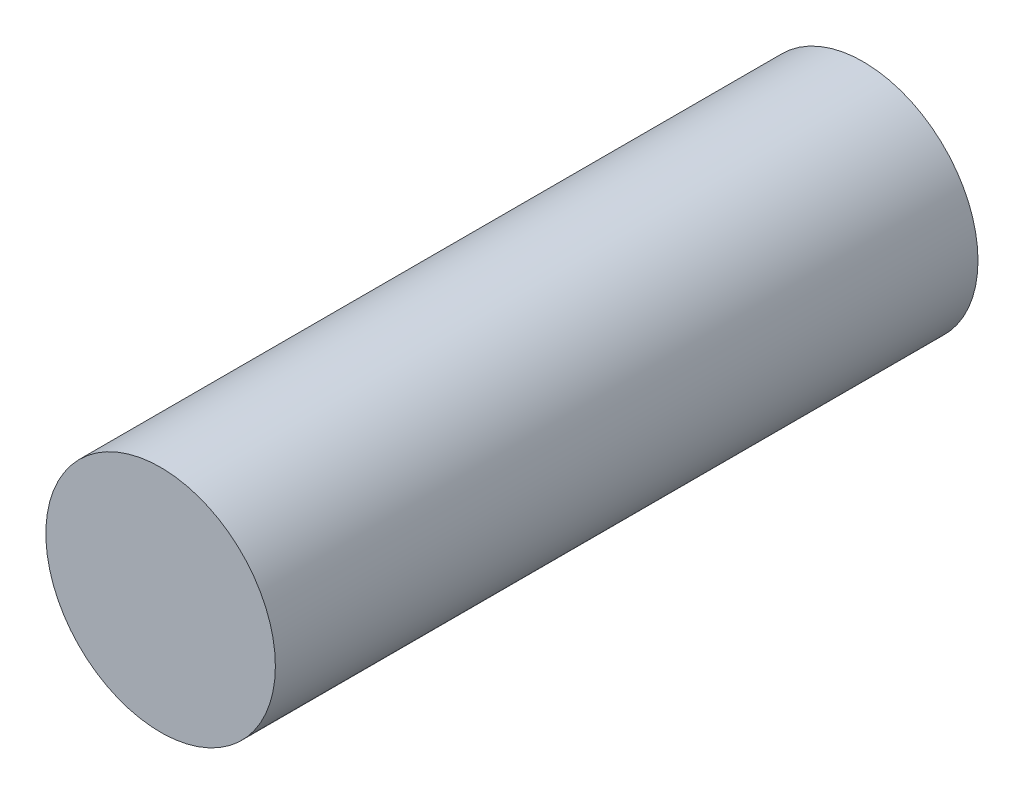
ISO-10303-21;
HEADER;
FILE_DESCRIPTION(('STEP AP214'),'2;1');
FILE_NAME('part.step','',(''),(''),'','','');
FILE_SCHEMA(('AUTOMOTIVE_DESIGN { 1 0 10303 214 1 1 1 1 }'));
ENDSEC;
DATA;
#1=APPLICATION_CONTEXT('core data for automotive mechanical design processes');
#2=APPLICATION_PROTOCOL_DEFINITION('international standard','automotive_design',2000,#1);
#3=PRODUCT_CONTEXT('',#1,'mechanical');
#4=PRODUCT('Part','Part','',(#3));
#5=PRODUCT_RELATED_PRODUCT_CATEGORY('part','',(#4));
#6=PRODUCT_DEFINITION_FORMATION('','',#4);
#7=PRODUCT_DEFINITION_CONTEXT('part definition',#1,'design');
#8=PRODUCT_DEFINITION('design','',#6,#7);
#9=PRODUCT_DEFINITION_SHAPE('','',#8);
#10=(LENGTH_UNIT() NAMED_UNIT(*) SI_UNIT(.MILLI.,.METRE.));
#11=(NAMED_UNIT(*) PLANE_ANGLE_UNIT() SI_UNIT($,.RADIAN.));
#12=(NAMED_UNIT(*) SI_UNIT($,.STERADIAN.) SOLID_ANGLE_UNIT());
#13=UNCERTAINTY_MEASURE_WITH_UNIT(LENGTH_MEASURE(1.E-05),#10,'distance_accuracy_value','');
#14=(GEOMETRIC_REPRESENTATION_CONTEXT(3) GLOBAL_UNCERTAINTY_ASSIGNED_CONTEXT((#13)) GLOBAL_UNIT_ASSIGNED_CONTEXT((#10,
#11,#12)) REPRESENTATION_CONTEXT('',''));
#15=CARTESIAN_POINT('',(0.,0.,0.));
#16=DIRECTION('',(0.,0.,1.));
#17=DIRECTION('',(1.,0.,0.));
#18=AXIS2_PLACEMENT_3D('',#15,#16,#17);
#19=CARTESIAN_POINT('',(0.,0.,15.));
#20=DIRECTION('',(0.,0.,-1.));
#21=DIRECTION('',(-1.,0.,0.));
#22=AXIS2_PLACEMENT_3D('',#19,#20,#21);
#23=CYLINDRICAL_SURFACE('',#22,2.45);
#24=CARTESIAN_POINT('',(0.,0.,15.));
#25=DIRECTION('',(0.,0.,1.));
#26=DIRECTION('',(1.,0.,0.));
#27=AXIS2_PLACEMENT_3D('',#24,#25,#26);
#28=CIRCLE('',#27,2.45);
#29=CARTESIAN_POINT('',(2.45,0.,15.));
#30=VERTEX_POINT('',#29);
#31=EDGE_CURVE('E10',#30,#30,#28,.T.);
#32=ORIENTED_EDGE('',*,*,#31,.F.);
#33=EDGE_LOOP('',(#32));
#34=FACE_BOUND('',#33,.T.);
#35=CARTESIAN_POINT('',(0.,0.,0.));
#36=DIRECTION('',(0.,0.,1.));
#37=DIRECTION('',(1.,0.,0.));
#38=AXIS2_PLACEMENT_3D('',#35,#36,#37);
#39=CIRCLE('',#38,2.45);
#40=CARTESIAN_POINT('',(2.45,0.,0.));
#41=VERTEX_POINT('',#40);
#42=EDGE_CURVE('E42',#41,#41,#39,.T.);
#43=ORIENTED_EDGE('',*,*,#42,.T.);
#44=EDGE_LOOP('',(#43));
#45=FACE_BOUND('',#44,.T.);
#46=ADVANCED_FACE('F39',(#34,#45),#23,.T.);
#47=CARTESIAN_POINT('',(0.,0.,15.));
#48=DIRECTION('',(0.,0.,1.));
#49=DIRECTION('',(1.,0.,0.));
#50=AXIS2_PLACEMENT_3D('',#47,#48,#49);
#51=PLANE('',#50);
#52=ORIENTED_EDGE('',*,*,#31,.T.);
#53=EDGE_LOOP('',(#52));
#54=FACE_BOUND('',#53,.T.);
#55=ADVANCED_FACE('F54',(#54),#51,.T.);
#56=CARTESIAN_POINT('',(0.,0.,0.));
#57=DIRECTION('',(0.,0.,1.));
#58=DIRECTION('',(1.,0.,0.));
#59=AXIS2_PLACEMENT_3D('',#56,#57,#58);
#60=PLANE('',#59);
#61=ORIENTED_EDGE('',*,*,#42,.F.);
#62=EDGE_LOOP('',(#61));
#63=FACE_BOUND('',#62,.T.);
#64=ADVANCED_FACE('F52',(#63),#60,.F.);
#65=CLOSED_SHELL('',(#46,#55,#64));
#66=MANIFOLD_SOLID_BREP('B2',#65);
#67=ADVANCED_BREP_SHAPE_REPRESENTATION('',(#18,#66),#14);
#68=SHAPE_DEFINITION_REPRESENTATION(#9,#67);
ENDSEC;
END-ISO-10303-21;
